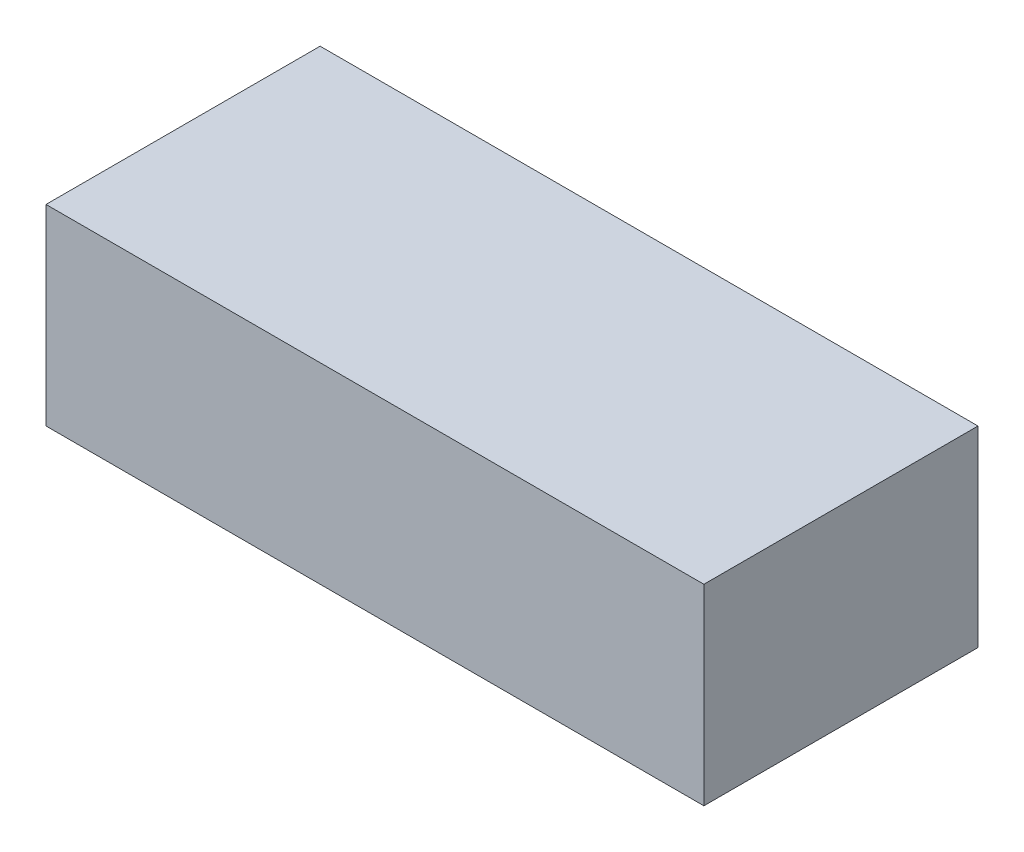
ISO-10303-21;
HEADER;
FILE_DESCRIPTION(('STEP AP214'),'2;1');
FILE_NAME('part.step','',(''),(''),'','','');
FILE_SCHEMA(('AUTOMOTIVE_DESIGN { 1 0 10303 214 1 1 1 1 }'));
ENDSEC;
DATA;
#1=APPLICATION_CONTEXT('core data for automotive mechanical design processes');
#2=APPLICATION_PROTOCOL_DEFINITION('international standard','automotive_design',2000,#1);
#3=PRODUCT_CONTEXT('',#1,'mechanical');
#4=PRODUCT('Part','Part','',(#3));
#5=PRODUCT_RELATED_PRODUCT_CATEGORY('part','',(#4));
#6=PRODUCT_DEFINITION_FORMATION('','',#4);
#7=PRODUCT_DEFINITION_CONTEXT('part definition',#1,'design');
#8=PRODUCT_DEFINITION('design','',#6,#7);
#9=PRODUCT_DEFINITION_SHAPE('','',#8);
#10=(LENGTH_UNIT() NAMED_UNIT(*) SI_UNIT(.MILLI.,.METRE.));
#11=(NAMED_UNIT(*) PLANE_ANGLE_UNIT() SI_UNIT($,.RADIAN.));
#12=(NAMED_UNIT(*) SI_UNIT($,.STERADIAN.) SOLID_ANGLE_UNIT());
#13=UNCERTAINTY_MEASURE_WITH_UNIT(LENGTH_MEASURE(1.E-05),#10,'distance_accuracy_value','');
#14=(GEOMETRIC_REPRESENTATION_CONTEXT(3) GLOBAL_UNCERTAINTY_ASSIGNED_CONTEXT((#13)) GLOBAL_UNIT_ASSIGNED_CONTEXT((#10,
#11,#12)) REPRESENTATION_CONTEXT('',''));
#15=CARTESIAN_POINT('',(0.,0.,0.));
#16=DIRECTION('',(0.,0.,1.));
#17=DIRECTION('',(1.,0.,0.));
#18=AXIS2_PLACEMENT_3D('',#15,#16,#17);
#19=CARTESIAN_POINT('',(0.,10.,0.));
#20=DIRECTION('',(0.,1.,0.));
#21=DIRECTION('',(0.,0.,1.));
#22=AXIS2_PLACEMENT_3D('',#19,#20,#21);
#23=PLANE('',#22);
#24=DIRECTION('',(0.,0.,1.));
#25=VECTOR('',#24,1.);
#26=CARTESIAN_POINT('',(-52.3769120422105,10.,-50.));
#27=LINE('',#26,#25);
#28=CARTESIAN_POINT('',(-52.3769120422105,10.,-50.));
#29=VERTEX_POINT('',#28);
#30=CARTESIAN_POINT('',(-52.3769120422105,10.,-10.));
#31=VERTEX_POINT('',#30);
#32=EDGE_CURVE('E214',#29,#31,#27,.T.);
#33=ORIENTED_EDGE('',*,*,#32,.F.);
#34=DIRECTION('',(1.,0.,0.));
#35=VECTOR('',#34,1.);
#36=CARTESIAN_POINT('',(65.0081833060556,10.,-50.));
#37=LINE('',#36,#35);
#38=CARTESIAN_POINT('',(-30.9918166939444,10.,-50.));
#39=VERTEX_POINT('',#38);
#40=EDGE_CURVE('E220',#29,#39,#37,.T.);
#41=ORIENTED_EDGE('',*,*,#40,.T.);
#42=DIRECTION('',(0.,0.,1.));
#43=VECTOR('',#42,1.);
#44=CARTESIAN_POINT('',(-30.9918166939444,10.,-10.));
#45=LINE('',#44,#43);
#46=CARTESIAN_POINT('',(-30.9918166939444,10.,-10.));
#47=VERTEX_POINT('',#46);
#48=EDGE_CURVE('E307',#39,#47,#45,.T.);
#49=ORIENTED_EDGE('',*,*,#48,.T.);
#50=DIRECTION('',(-1.,0.,0.));
#51=VECTOR('',#50,1.);
#52=CARTESIAN_POINT('',(-54.9918166939444,10.,-10.));
#53=LINE('',#52,#51);
#54=EDGE_CURVE('E310',#47,#31,#53,.T.);
#55=ORIENTED_EDGE('',*,*,#54,.T.);
#56=EDGE_LOOP('',(#33,#41,#49,#55));
#57=FACE_BOUND('',#56,.T.);
#58=ADVANCED_FACE('F42',(#57),#23,.F.);
#59=CARTESIAN_POINT('',(0.,-20.,-10.));
#60=DIRECTION('',(0.,0.,1.));
#61=DIRECTION('',(1.,0.,0.));
#62=AXIS2_PLACEMENT_3D('',#59,#60,#61);
#63=PLANE('',#62);
#64=DIRECTION('',(0.,-1.,0.));
#65=VECTOR('',#64,1.);
#66=CARTESIAN_POINT('',(-52.3769120422105,10.,-10.));
#67=LINE('',#66,#65);
#68=CARTESIAN_POINT('',(-52.3769120422105,-20.,-10.));
#69=VERTEX_POINT('',#68);
#70=EDGE_CURVE('E57',#31,#69,#67,.T.);
#71=ORIENTED_EDGE('',*,*,#70,.F.);
#72=ORIENTED_EDGE('',*,*,#54,.F.);
#73=DIRECTION('',(0.,1.,0.));
#74=VECTOR('',#73,1.);
#75=CARTESIAN_POINT('',(-30.9918166939444,-20.,-10.));
#76=LINE('',#75,#74);
#77=CARTESIAN_POINT('',(-30.9918166939444,-20.,-10.));
#78=VERTEX_POINT('',#77);
#79=EDGE_CURVE('E365',#78,#47,#76,.T.);
#80=ORIENTED_EDGE('',*,*,#79,.F.);
#81=DIRECTION('',(1.,0.,0.));
#82=VECTOR('',#81,1.);
#83=CARTESIAN_POINT('',(0.,-20.,-10.));
#84=LINE('',#83,#82);
#85=EDGE_CURVE('E316',#69,#78,#84,.T.);
#86=ORIENTED_EDGE('',*,*,#85,.F.);
#87=EDGE_LOOP('',(#71,#72,#80,#86));
#88=FACE_BOUND('',#87,.T.);
#89=ADVANCED_FACE('F440',(#88),#63,.F.);
#90=DIRECTION('',(0.,0.,1.));
#91=VECTOR('',#90,1.);
#92=CARTESIAN_POINT('',(62.568131576715,10.,-50.));
#93=LINE('',#92,#91);
#94=CARTESIAN_POINT('',(62.568131576715,10.,-50.));
#95=VERTEX_POINT('',#94);
#96=CARTESIAN_POINT('',(62.568131576715,10.,-10.));
#97=VERTEX_POINT('',#96);
#98=EDGE_CURVE('E233',#95,#97,#93,.T.);
#99=ORIENTED_EDGE('',*,*,#98,.T.);
#100=DIRECTION('',(-1.,0.,0.));
#101=VECTOR('',#100,1.);
#102=CARTESIAN_POINT('',(43.0081833060556,10.,-10.));
#103=LINE('',#102,#101);
#104=CARTESIAN_POINT('',(43.0081833060556,10.,-10.));
#105=VERTEX_POINT('',#104);
#106=EDGE_CURVE('E274',#97,#105,#103,.T.);
#107=ORIENTED_EDGE('',*,*,#106,.T.);
#108=DIRECTION('',(0.,0.,-1.));
#109=VECTOR('',#108,1.);
#110=CARTESIAN_POINT('',(43.0081833060556,10.,-25.));
#111=LINE('',#110,#109);
#112=CARTESIAN_POINT('',(43.0081833060556,10.,-50.));
#113=VERTEX_POINT('',#112);
#114=EDGE_CURVE('E277',#105,#113,#111,.T.);
#115=ORIENTED_EDGE('',*,*,#114,.T.);
#116=EDGE_CURVE('E272',#113,#95,#37,.T.);
#117=ORIENTED_EDGE('',*,*,#116,.T.);
#118=EDGE_LOOP('',(#99,#107,#115,#117));
#119=FACE_BOUND('',#118,.T.);
#120=ADVANCED_FACE('F401',(#119),#23,.F.);
#121=CARTESIAN_POINT('',(0.,-20.,-10.));
#122=DIRECTION('',(0.,0.,1.));
#123=DIRECTION('',(1.,0.,0.));
#124=AXIS2_PLACEMENT_3D('',#121,#122,#123);
#125=PLANE('',#124);
#126=DIRECTION('',(0.,1.,0.));
#127=VECTOR('',#126,1.);
#128=CARTESIAN_POINT('',(62.568131576715,-20.,-10.));
#129=LINE('',#128,#127);
#130=CARTESIAN_POINT('',(62.568131576715,-20.,-10.));
#131=VERTEX_POINT('',#130);
#132=EDGE_CURVE('E224',#131,#97,#129,.T.);
#133=ORIENTED_EDGE('',*,*,#132,.F.);
#134=DIRECTION('',(1.,0.,0.));
#135=VECTOR('',#134,1.);
#136=CARTESIAN_POINT('',(0.,-20.,-10.));
#137=LINE('',#136,#135);
#138=CARTESIAN_POINT('',(43.0081833060556,-20.,-10.));
#139=VERTEX_POINT('',#138);
#140=EDGE_CURVE('E344',#139,#131,#137,.T.);
#141=ORIENTED_EDGE('',*,*,#140,.F.);
#142=DIRECTION('',(0.,1.,0.));
#143=VECTOR('',#142,1.);
#144=CARTESIAN_POINT('',(43.0081833060556,-20.,-10.));
#145=LINE('',#144,#143);
#146=EDGE_CURVE('E350',#139,#105,#145,.T.);
#147=ORIENTED_EDGE('',*,*,#146,.T.);
#148=ORIENTED_EDGE('',*,*,#106,.F.);
#149=EDGE_LOOP('',(#133,#141,#147,#148));
#150=FACE_BOUND('',#149,.T.);
#151=ADVANCED_FACE('F488',(#150),#125,.F.);
#152=CARTESIAN_POINT('',(19.0081833060556,10.,-50.));
#153=VERTEX_POINT('',#152);
#154=CARTESIAN_POINT('',(41.0081833060556,10.,-50.));
#155=VERTEX_POINT('',#154);
#156=EDGE_CURVE('E403',#153,#155,#37,.T.);
#157=ORIENTED_EDGE('',*,*,#156,.T.);
#158=DIRECTION('',(0.,0.,1.));
#159=VECTOR('',#158,1.);
#160=CARTESIAN_POINT('',(41.0081833060556,10.,-10.));
#161=LINE('',#160,#159);
#162=CARTESIAN_POINT('',(41.0081833060556,10.,-10.));
#163=VERTEX_POINT('',#162);
#164=EDGE_CURVE('E280',#155,#163,#161,.T.);
#165=ORIENTED_EDGE('',*,*,#164,.T.);
#166=DIRECTION('',(-1.,0.,0.));
#167=VECTOR('',#166,1.);
#168=CARTESIAN_POINT('',(19.0081833060556,10.,-10.));
#169=LINE('',#168,#167);
#170=CARTESIAN_POINT('',(19.0081833060556,10.,-10.));
#171=VERTEX_POINT('',#170);
#172=EDGE_CURVE('E283',#163,#171,#169,.T.);
#173=ORIENTED_EDGE('',*,*,#172,.T.);
#174=DIRECTION('',(0.,0.,-1.));
#175=VECTOR('',#174,1.);
#176=CARTESIAN_POINT('',(19.0081833060556,10.,-25.));
#177=LINE('',#176,#175);
#178=EDGE_CURVE('E286',#171,#153,#177,.T.);
#179=ORIENTED_EDGE('',*,*,#178,.T.);
#180=EDGE_LOOP('',(#157,#165,#173,#179));
#181=FACE_BOUND('',#180,.T.);
#182=ADVANCED_FACE('F479',(#181),#23,.F.);
#183=CARTESIAN_POINT('',(-4.99349581397723,10.,-50.));
#184=VERTEX_POINT('',#183);
#185=CARTESIAN_POINT('',(17.0081833060556,10.,-50.));
#186=VERTEX_POINT('',#185);
#187=EDGE_CURVE('E405',#184,#186,#37,.T.);
#188=ORIENTED_EDGE('',*,*,#187,.T.);
#189=DIRECTION('',(0.,0.,1.));
#190=VECTOR('',#189,1.);
#191=CARTESIAN_POINT('',(17.0081833060556,10.,-10.));
#192=LINE('',#191,#190);
#193=CARTESIAN_POINT('',(17.0081833060556,10.,-10.));
#194=VERTEX_POINT('',#193);
#195=EDGE_CURVE('E289',#186,#194,#192,.T.);
#196=ORIENTED_EDGE('',*,*,#195,.T.);
#197=DIRECTION('',(-1.,0.,0.));
#198=VECTOR('',#197,1.);
#199=CARTESIAN_POINT('',(-4.99349581397723,10.,-10.));
#200=LINE('',#199,#198);
#201=CARTESIAN_POINT('',(-4.99349581397723,10.,-10.));
#202=VERTEX_POINT('',#201);
#203=EDGE_CURVE('E292',#194,#202,#200,.T.);
#204=ORIENTED_EDGE('',*,*,#203,.T.);
#205=DIRECTION('',(0.,0.,-1.));
#206=VECTOR('',#205,1.);
#207=CARTESIAN_POINT('',(-4.99349581397723,10.,-25.));
#208=LINE('',#207,#206);
#209=EDGE_CURVE('E295',#202,#184,#208,.T.);
#210=ORIENTED_EDGE('',*,*,#209,.T.);
#211=EDGE_LOOP('',(#188,#196,#204,#210));
#212=FACE_BOUND('',#211,.T.);
#213=ADVANCED_FACE('F487',(#212),#23,.F.);
#214=CARTESIAN_POINT('',(-28.9918166939444,10.,-50.));
#215=VERTEX_POINT('',#214);
#216=CARTESIAN_POINT('',(-6.99181669394436,10.,-50.));
#217=VERTEX_POINT('',#216);
#218=EDGE_CURVE('E275',#215,#217,#37,.T.);
#219=ORIENTED_EDGE('',*,*,#218,.T.);
#220=DIRECTION('',(0.,0.,1.));
#221=VECTOR('',#220,1.);
#222=CARTESIAN_POINT('',(-6.99181669394436,10.,-10.));
#223=LINE('',#222,#221);
#224=CARTESIAN_POINT('',(-6.99181669394436,10.,-10.));
#225=VERTEX_POINT('',#224);
#226=EDGE_CURVE('E298',#217,#225,#223,.T.);
#227=ORIENTED_EDGE('',*,*,#226,.T.);
#228=DIRECTION('',(-1.,0.,0.));
#229=VECTOR('',#228,1.);
#230=CARTESIAN_POINT('',(-28.9918166939444,10.,-10.));
#231=LINE('',#230,#229);
#232=CARTESIAN_POINT('',(-28.9918166939444,10.,-10.));
#233=VERTEX_POINT('',#232);
#234=EDGE_CURVE('E301',#225,#233,#231,.T.);
#235=ORIENTED_EDGE('',*,*,#234,.T.);
#236=DIRECTION('',(0.,0.,-1.));
#237=VECTOR('',#236,1.);
#238=CARTESIAN_POINT('',(-28.9918166939444,10.,-25.));
#239=LINE('',#238,#237);
#240=EDGE_CURVE('E304',#233,#215,#239,.T.);
#241=ORIENTED_EDGE('',*,*,#240,.T.);
#242=EDGE_LOOP('',(#219,#227,#235,#241));
#243=FACE_BOUND('',#242,.T.);
#244=ADVANCED_FACE('F414',(#243),#23,.F.);
#245=CARTESIAN_POINT('',(-54.9918166939444,15.,0.));
#246=DIRECTION('',(1.,0.,0.));
#247=DIRECTION('',(0.,0.,-1.));
#248=AXIS2_PLACEMENT_3D('',#245,#246,#247);
#249=PLANE('',#248);
#250=DIRECTION('',(0.,-1.,0.));
#251=VECTOR('',#250,1.);
#252=CARTESIAN_POINT('',(-54.9918166939444,15.,-50.));
#253=LINE('',#252,#251);
#254=CARTESIAN_POINT('',(-54.9918166939444,15.,-50.));
#255=VERTEX_POINT('',#254);
#256=CARTESIAN_POINT('',(-54.9918166939444,-20.,-50.));
#257=VERTEX_POINT('',#256);
#258=EDGE_CURVE('E374',#255,#257,#253,.T.);
#259=ORIENTED_EDGE('',*,*,#258,.T.);
#260=DIRECTION('',(0.,0.,-1.));
#261=VECTOR('',#260,1.);
#262=CARTESIAN_POINT('',(-54.9918166939444,-20.,0.));
#263=LINE('',#262,#261);
#264=CARTESIAN_POINT('',(-54.9918166939444,-20.,0.));
#265=VERTEX_POINT('',#264);
#266=EDGE_CURVE('E212',#265,#257,#263,.T.);
#267=ORIENTED_EDGE('',*,*,#266,.F.);
#268=DIRECTION('',(0.,-1.,0.));
#269=VECTOR('',#268,1.);
#270=CARTESIAN_POINT('',(-54.9918166939444,15.,0.));
#271=LINE('',#270,#269);
#272=CARTESIAN_POINT('',(-54.9918166939444,15.,0.));
#273=VERTEX_POINT('',#272);
#274=EDGE_CURVE('E11',#273,#265,#271,.T.);
#275=ORIENTED_EDGE('',*,*,#274,.F.);
#276=DIRECTION('',(0.,0.,1.));
#277=VECTOR('',#276,1.);
#278=CARTESIAN_POINT('',(-54.9918166939444,15.,0.));
#279=LINE('',#278,#277);
#280=EDGE_CURVE('E367',#255,#273,#279,.T.);
#281=ORIENTED_EDGE('',*,*,#280,.F.);
#282=EDGE_LOOP('',(#259,#267,#275,#281));
#283=FACE_BOUND('',#282,.T.);
#284=ADVANCED_FACE('F44',(#283),#249,.F.);
#285=CARTESIAN_POINT('',(-54.9918166939444,15.,0.));
#286=DIRECTION('',(0.,0.,-1.));
#287=DIRECTION('',(-1.,0.,0.));
#288=AXIS2_PLACEMENT_3D('',#285,#286,#287);
#289=PLANE('',#288);
#290=ORIENTED_EDGE('',*,*,#274,.T.);
#291=DIRECTION('',(-1.,0.,0.));
#292=VECTOR('',#291,1.);
#293=CARTESIAN_POINT('',(0.,-20.,0.));
#294=LINE('',#293,#292);
#295=CARTESIAN_POINT('',(65.0081833060557,-20.,0.));
#296=VERTEX_POINT('',#295);
#297=EDGE_CURVE('E313',#296,#265,#294,.T.);
#298=ORIENTED_EDGE('',*,*,#297,.F.);
#299=DIRECTION('',(0.,-1.,0.));
#300=VECTOR('',#299,1.);
#301=CARTESIAN_POINT('',(65.0081833060556,15.,0.));
#302=LINE('',#301,#300);
#303=CARTESIAN_POINT('',(65.0081833060556,15.,0.));
#304=VERTEX_POINT('',#303);
#305=EDGE_CURVE('E50',#304,#296,#302,.T.);
#306=ORIENTED_EDGE('',*,*,#305,.F.);
#307=DIRECTION('',(1.,0.,0.));
#308=VECTOR('',#307,1.);
#309=CARTESIAN_POINT('',(-54.9918166939444,15.,0.));
#310=LINE('',#309,#308);
#311=EDGE_CURVE('E369',#273,#304,#310,.T.);
#312=ORIENTED_EDGE('',*,*,#311,.F.);
#313=EDGE_LOOP('',(#290,#298,#306,#312));
#314=FACE_BOUND('',#313,.T.);
#315=ADVANCED_FACE('F387',(#314),#289,.F.);
#316=CARTESIAN_POINT('',(65.0081833060556,15.,0.));
#317=DIRECTION('',(-1.,0.,0.));
#318=DIRECTION('',(0.,0.,1.));
#319=AXIS2_PLACEMENT_3D('',#316,#317,#318);
#320=PLANE('',#319);
#321=DIRECTION('',(0.,0.,1.));
#322=VECTOR('',#321,1.);
#323=CARTESIAN_POINT('',(65.0081833060556,-20.,0.));
#324=LINE('',#323,#322);
#325=CARTESIAN_POINT('',(65.0081833060556,-20.,-50.));
#326=VERTEX_POINT('',#325);
#327=EDGE_CURVE('E347',#326,#296,#324,.T.);
#328=ORIENTED_EDGE('',*,*,#327,.F.);
#329=DIRECTION('',(0.,-1.,0.));
#330=VECTOR('',#329,1.);
#331=CARTESIAN_POINT('',(65.0081833060556,15.,-50.));
#332=LINE('',#331,#330);
#333=CARTESIAN_POINT('',(65.0081833060556,15.,-50.));
#334=VERTEX_POINT('',#333);
#335=EDGE_CURVE('E376',#334,#326,#332,.T.);
#336=ORIENTED_EDGE('',*,*,#335,.F.);
#337=DIRECTION('',(0.,0.,-1.));
#338=VECTOR('',#337,1.);
#339=CARTESIAN_POINT('',(65.0081833060556,15.,0.));
#340=LINE('',#339,#338);
#341=EDGE_CURVE('E371',#304,#334,#340,.T.);
#342=ORIENTED_EDGE('',*,*,#341,.F.);
#343=ORIENTED_EDGE('',*,*,#305,.T.);
#344=EDGE_LOOP('',(#328,#336,#342,#343));
#345=FACE_BOUND('',#344,.T.);
#346=ADVANCED_FACE('F381',(#345),#320,.F.);
#347=CARTESIAN_POINT('',(-54.9918166939444,15.,-50.));
#348=DIRECTION('',(0.,0.,1.));
#349=DIRECTION('',(1.,0.,0.));
#350=AXIS2_PLACEMENT_3D('',#347,#348,#349);
#351=PLANE('',#350);
#352=CARTESIAN_POINT('',(62.5081833060556,12.5,-50.));
#353=DIRECTION('',(0.,0.,-1.));
#354=DIRECTION('',(-1.,0.,0.));
#355=AXIS2_PLACEMENT_3D('',#352,#353,#354);
#356=CIRCLE('',#355,1.5);
#357=CARTESIAN_POINT('',(61.0081833060556,12.5,-50.));
#358=VERTEX_POINT('',#357);
#359=EDGE_CURVE('E443',#358,#358,#356,.T.);
#360=ORIENTED_EDGE('',*,*,#359,.F.);
#361=EDGE_LOOP('',(#360));
#362=FACE_BOUND('',#361,.T.);
#363=CARTESIAN_POINT('',(-52.4918166939444,12.5,-50.));
#364=DIRECTION('',(0.,0.,-1.));
#365=DIRECTION('',(-1.,0.,0.));
#366=AXIS2_PLACEMENT_3D('',#363,#364,#365);
#367=CIRCLE('',#366,1.5);
#368=CARTESIAN_POINT('',(-53.9918166939444,12.5,-50.));
#369=VERTEX_POINT('',#368);
#370=EDGE_CURVE('E449',#369,#369,#367,.T.);
#371=ORIENTED_EDGE('',*,*,#370,.F.);
#372=EDGE_LOOP('',(#371));
#373=FACE_BOUND('',#372,.T.);
#374=ORIENTED_EDGE('',*,*,#335,.T.);
#375=DIRECTION('',(-1.,0.,0.));
#376=VECTOR('',#375,1.);
#377=CARTESIAN_POINT('',(65.0081833060556,-20.,-50.));
#378=LINE('',#377,#376);
#379=CARTESIAN_POINT('',(62.568131576715,-20.,-50.));
#380=VERTEX_POINT('',#379);
#381=EDGE_CURVE('E226',#326,#380,#378,.T.);
#382=ORIENTED_EDGE('',*,*,#381,.T.);
#383=DIRECTION('',(0.,1.,0.));
#384=VECTOR('',#383,1.);
#385=CARTESIAN_POINT('',(62.568131576715,-20.,-50.));
#386=LINE('',#385,#384);
#387=EDGE_CURVE('E232',#380,#95,#386,.T.);
#388=ORIENTED_EDGE('',*,*,#387,.T.);
#389=ORIENTED_EDGE('',*,*,#116,.F.);
#390=DIRECTION('',(0.,1.,0.));
#391=VECTOR('',#390,1.);
#392=CARTESIAN_POINT('',(43.0081833060556,-20.,-50.));
#393=LINE('',#392,#391);
#394=CARTESIAN_POINT('',(43.0081833060556,-20.,-50.));
#395=VERTEX_POINT('',#394);
#396=EDGE_CURVE('E257',#395,#113,#393,.T.);
#397=ORIENTED_EDGE('',*,*,#396,.F.);
#398=DIRECTION('',(1.,0.,0.));
#399=VECTOR('',#398,1.);
#400=CARTESIAN_POINT('',(-30.9918166939444,-20.,-50.));
#401=LINE('',#400,#399);
#402=CARTESIAN_POINT('',(41.0081833060556,-20.,-50.));
#403=VERTEX_POINT('',#402);
#404=EDGE_CURVE('E243',#403,#395,#401,.T.);
#405=ORIENTED_EDGE('',*,*,#404,.F.);
#406=DIRECTION('',(0.,1.,0.));
#407=VECTOR('',#406,1.);
#408=CARTESIAN_POINT('',(41.0081833060556,-20.,-50.));
#409=LINE('',#408,#407);
#410=EDGE_CURVE('E259',#403,#155,#409,.T.);
#411=ORIENTED_EDGE('',*,*,#410,.T.);
#412=ORIENTED_EDGE('',*,*,#156,.F.);
#413=DIRECTION('',(0.,1.,0.));
#414=VECTOR('',#413,1.);
#415=CARTESIAN_POINT('',(19.0081833060556,-20.,-50.));
#416=LINE('',#415,#414);
#417=CARTESIAN_POINT('',(19.0081833060556,-20.,-50.));
#418=VERTEX_POINT('',#417);
#419=EDGE_CURVE('E262',#418,#153,#416,.T.);
#420=ORIENTED_EDGE('',*,*,#419,.F.);
#421=CARTESIAN_POINT('',(17.0081833060556,-20.,-50.));
#422=VERTEX_POINT('',#421);
#423=EDGE_CURVE('E988',#422,#418,#401,.T.);
#424=ORIENTED_EDGE('',*,*,#423,.F.);
#425=DIRECTION('',(0.,1.,0.));
#426=VECTOR('',#425,1.);
#427=CARTESIAN_POINT('',(17.0081833060556,-20.,-50.));
#428=LINE('',#427,#426);
#429=EDGE_CURVE('E264',#422,#186,#428,.T.);
#430=ORIENTED_EDGE('',*,*,#429,.T.);
#431=ORIENTED_EDGE('',*,*,#187,.F.);
#432=DIRECTION('',(0.,1.,0.));
#433=VECTOR('',#432,1.);
#434=CARTESIAN_POINT('',(-4.99349581397723,-20.,-50.));
#435=LINE('',#434,#433);
#436=CARTESIAN_POINT('',(-4.99349581397723,-20.,-50.));
#437=VERTEX_POINT('',#436);
#438=EDGE_CURVE('E266',#437,#184,#435,.T.);
#439=ORIENTED_EDGE('',*,*,#438,.F.);
#440=CARTESIAN_POINT('',(-6.99181669394436,-20.,-50.));
#441=VERTEX_POINT('',#440);
#442=EDGE_CURVE('E256',#441,#437,#401,.T.);
#443=ORIENTED_EDGE('',*,*,#442,.F.);
#444=DIRECTION('',(0.,1.,0.));
#445=VECTOR('',#444,1.);
#446=CARTESIAN_POINT('',(-6.99181669394436,-20.,-50.));
#447=LINE('',#446,#445);
#448=EDGE_CURVE('E268',#441,#217,#447,.T.);
#449=ORIENTED_EDGE('',*,*,#448,.T.);
#450=ORIENTED_EDGE('',*,*,#218,.F.);
#451=DIRECTION('',(0.,1.,0.));
#452=VECTOR('',#451,1.);
#453=CARTESIAN_POINT('',(-28.9918166939444,-20.,-50.));
#454=LINE('',#453,#452);
#455=CARTESIAN_POINT('',(-28.9918166939444,-20.,-50.));
#456=VERTEX_POINT('',#455);
#457=EDGE_CURVE('E270',#456,#215,#454,.T.);
#458=ORIENTED_EDGE('',*,*,#457,.F.);
#459=CARTESIAN_POINT('',(-30.9918166939444,-20.,-50.));
#460=VERTEX_POINT('',#459);
#461=EDGE_CURVE('E252',#460,#456,#401,.T.);
#462=ORIENTED_EDGE('',*,*,#461,.F.);
#463=DIRECTION('',(0.,1.,0.));
#464=VECTOR('',#463,1.);
#465=CARTESIAN_POINT('',(-30.9918166939444,-20.,-50.));
#466=LINE('',#465,#464);
#467=EDGE_CURVE('E255',#460,#39,#466,.T.);
#468=ORIENTED_EDGE('',*,*,#467,.T.);
#469=ORIENTED_EDGE('',*,*,#40,.F.);
#470=DIRECTION('',(0.,-1.,0.));
#471=VECTOR('',#470,1.);
#472=CARTESIAN_POINT('',(-52.3769120422105,10.,-50.));
#473=LINE('',#472,#471);
#474=CARTESIAN_POINT('',(-52.3769120422105,-20.,-50.));
#475=VERTEX_POINT('',#474);
#476=EDGE_CURVE('E215',#29,#475,#473,.T.);
#477=ORIENTED_EDGE('',*,*,#476,.T.);
#478=DIRECTION('',(-1.,0.,0.));
#479=VECTOR('',#478,1.);
#480=CARTESIAN_POINT('',(-52.3769120422105,-20.,-50.));
#481=LINE('',#480,#479);
#482=EDGE_CURVE('E204',#475,#257,#481,.T.);
#483=ORIENTED_EDGE('',*,*,#482,.T.);
#484=ORIENTED_EDGE('',*,*,#258,.F.);
#485=DIRECTION('',(-1.,0.,0.));
#486=VECTOR('',#485,1.);
#487=CARTESIAN_POINT('',(-54.9918166939444,15.,-50.));
#488=LINE('',#487,#486);
#489=EDGE_CURVE('E65',#334,#255,#488,.T.);
#490=ORIENTED_EDGE('',*,*,#489,.F.);
#491=EDGE_LOOP('',(#374,#382,#388,#389,#397,#405,#411,#412,#420,#424,#430,#431,#439,#443,#449,
#450,#458,#462,#468,#469,#477,#483,#484,#490));
#492=FACE_BOUND('',#491,.T.);
#493=ADVANCED_FACE('F218',(#362,#373,#492),#351,.F.);
#494=CARTESIAN_POINT('',(0.,15.,0.));
#495=DIRECTION('',(0.,-1.,0.));
#496=DIRECTION('',(0.,0.,-1.));
#497=AXIS2_PLACEMENT_3D('',#494,#495,#496);
#498=PLANE('',#497);
#499=ORIENTED_EDGE('',*,*,#280,.T.);
#500=ORIENTED_EDGE('',*,*,#311,.T.);
#501=ORIENTED_EDGE('',*,*,#341,.T.);
#502=ORIENTED_EDGE('',*,*,#489,.T.);
#503=EDGE_LOOP('',(#499,#500,#501,#502));
#504=FACE_BOUND('',#503,.T.);
#505=ADVANCED_FACE('F459',(#504),#498,.F.);
#506=CARTESIAN_POINT('',(-30.9918166939444,-20.,0.));
#507=DIRECTION('',(-1.,0.,0.));
#508=DIRECTION('',(0.,0.,1.));
#509=AXIS2_PLACEMENT_3D('',#506,#507,#508);
#510=PLANE('',#509);
#511=ORIENTED_EDGE('',*,*,#467,.F.);
#512=DIRECTION('',(0.,0.,1.));
#513=VECTOR('',#512,1.);
#514=CARTESIAN_POINT('',(-30.9918166939444,-20.,0.));
#515=LINE('',#514,#513);
#516=EDGE_CURVE('E318',#460,#78,#515,.T.);
#517=ORIENTED_EDGE('',*,*,#516,.T.);
#518=ORIENTED_EDGE('',*,*,#79,.T.);
#519=ORIENTED_EDGE('',*,*,#48,.F.);
#520=EDGE_LOOP('',(#511,#517,#518,#519));
#521=FACE_BOUND('',#520,.T.);
#522=ADVANCED_FACE('F435',(#521),#510,.T.);
#523=CARTESIAN_POINT('',(-28.9918166939444,-20.,0.));
#524=DIRECTION('',(-1.,0.,0.));
#525=DIRECTION('',(0.,0.,1.));
#526=AXIS2_PLACEMENT_3D('',#523,#524,#525);
#527=PLANE('',#526);
#528=DIRECTION('',(0.,0.,1.));
#529=VECTOR('',#528,1.);
#530=CARTESIAN_POINT('',(-28.9918166939444,-20.,0.));
#531=LINE('',#530,#529);
#532=CARTESIAN_POINT('',(-28.9918166939444,-20.,-10.));
#533=VERTEX_POINT('',#532);
#534=EDGE_CURVE('E321',#456,#533,#531,.T.);
#535=ORIENTED_EDGE('',*,*,#534,.F.);
#536=ORIENTED_EDGE('',*,*,#457,.T.);
#537=ORIENTED_EDGE('',*,*,#240,.F.);
#538=DIRECTION('',(0.,1.,0.));
#539=VECTOR('',#538,1.);
#540=CARTESIAN_POINT('',(-28.9918166939444,-20.,-10.));
#541=LINE('',#540,#539);
#542=EDGE_CURVE('E363',#533,#233,#541,.T.);
#543=ORIENTED_EDGE('',*,*,#542,.F.);
#544=EDGE_LOOP('',(#535,#536,#537,#543));
#545=FACE_BOUND('',#544,.T.);
#546=ADVANCED_FACE('F430',(#545),#527,.F.);
#547=CARTESIAN_POINT('',(0.,-20.,-10.));
#548=DIRECTION('',(0.,0.,1.));
#549=DIRECTION('',(1.,0.,0.));
#550=AXIS2_PLACEMENT_3D('',#547,#548,#549);
#551=PLANE('',#550);
#552=ORIENTED_EDGE('',*,*,#542,.T.);
#553=ORIENTED_EDGE('',*,*,#234,.F.);
#554=DIRECTION('',(0.,1.,0.));
#555=VECTOR('',#554,1.);
#556=CARTESIAN_POINT('',(-6.99181669394436,-20.,-10.));
#557=LINE('',#556,#555);
#558=CARTESIAN_POINT('',(-6.99181669394436,-20.,-10.));
#559=VERTEX_POINT('',#558);
#560=EDGE_CURVE('E361',#559,#225,#557,.T.);
#561=ORIENTED_EDGE('',*,*,#560,.F.);
#562=DIRECTION('',(1.,0.,0.));
#563=VECTOR('',#562,1.);
#564=CARTESIAN_POINT('',(0.,-20.,-10.));
#565=LINE('',#564,#563);
#566=EDGE_CURVE('E323',#533,#559,#565,.T.);
#567=ORIENTED_EDGE('',*,*,#566,.F.);
#568=EDGE_LOOP('',(#552,#553,#561,#567));
#569=FACE_BOUND('',#568,.T.);
#570=ADVANCED_FACE('F426',(#569),#551,.F.);
#571=CARTESIAN_POINT('',(-6.99181669394436,-20.,0.));
#572=DIRECTION('',(-1.,0.,0.));
#573=DIRECTION('',(0.,0.,1.));
#574=AXIS2_PLACEMENT_3D('',#571,#572,#573);
#575=PLANE('',#574);
#576=ORIENTED_EDGE('',*,*,#448,.F.);
#577=DIRECTION('',(0.,0.,1.));
#578=VECTOR('',#577,1.);
#579=CARTESIAN_POINT('',(-6.99181669394436,-20.,0.));
#580=LINE('',#579,#578);
#581=EDGE_CURVE('E326',#441,#559,#580,.T.);
#582=ORIENTED_EDGE('',*,*,#581,.T.);
#583=ORIENTED_EDGE('',*,*,#560,.T.);
#584=ORIENTED_EDGE('',*,*,#226,.F.);
#585=EDGE_LOOP('',(#576,#582,#583,#584));
#586=FACE_BOUND('',#585,.T.);
#587=ADVANCED_FACE('F421',(#586),#575,.T.);
#588=CARTESIAN_POINT('',(-4.99349581397723,-20.,0.));
#589=DIRECTION('',(-1.,0.,0.));
#590=DIRECTION('',(0.,0.,1.));
#591=AXIS2_PLACEMENT_3D('',#588,#589,#590);
#592=PLANE('',#591);
#593=DIRECTION('',(0.,0.,1.));
#594=VECTOR('',#593,1.);
#595=CARTESIAN_POINT('',(-4.99349581397723,-20.,0.));
#596=LINE('',#595,#594);
#597=CARTESIAN_POINT('',(-4.99349581397723,-20.,-10.));
#598=VERTEX_POINT('',#597);
#599=EDGE_CURVE('E328',#437,#598,#596,.T.);
#600=ORIENTED_EDGE('',*,*,#599,.F.);
#601=ORIENTED_EDGE('',*,*,#438,.T.);
#602=ORIENTED_EDGE('',*,*,#209,.F.);
#603=DIRECTION('',(0.,1.,0.));
#604=VECTOR('',#603,1.);
#605=CARTESIAN_POINT('',(-4.99349581397723,-20.,-10.));
#606=LINE('',#605,#604);
#607=EDGE_CURVE('E359',#598,#202,#606,.T.);
#608=ORIENTED_EDGE('',*,*,#607,.F.);
#609=EDGE_LOOP('',(#600,#601,#602,#608));
#610=FACE_BOUND('',#609,.T.);
#611=ADVANCED_FACE('F656',(#610),#592,.F.);
#612=CARTESIAN_POINT('',(0.,-20.,-10.));
#613=DIRECTION('',(0.,0.,1.));
#614=DIRECTION('',(1.,0.,0.));
#615=AXIS2_PLACEMENT_3D('',#612,#613,#614);
#616=PLANE('',#615);
#617=ORIENTED_EDGE('',*,*,#607,.T.);
#618=ORIENTED_EDGE('',*,*,#203,.F.);
#619=DIRECTION('',(0.,1.,0.));
#620=VECTOR('',#619,1.);
#621=CARTESIAN_POINT('',(17.0081833060556,-20.,-10.));
#622=LINE('',#621,#620);
#623=CARTESIAN_POINT('',(17.0081833060556,-20.,-10.));
#624=VERTEX_POINT('',#623);
#625=EDGE_CURVE('E357',#624,#194,#622,.T.);
#626=ORIENTED_EDGE('',*,*,#625,.F.);
#627=DIRECTION('',(1.,0.,0.));
#628=VECTOR('',#627,1.);
#629=CARTESIAN_POINT('',(0.,-20.,-10.));
#630=LINE('',#629,#628);
#631=EDGE_CURVE('E330',#598,#624,#630,.T.);
#632=ORIENTED_EDGE('',*,*,#631,.F.);
#633=EDGE_LOOP('',(#617,#618,#626,#632));
#634=FACE_BOUND('',#633,.T.);
#635=ADVANCED_FACE('F663',(#634),#616,.F.);
#636=CARTESIAN_POINT('',(17.0081833060556,-20.,0.));
#637=DIRECTION('',(-1.,0.,0.));
#638=DIRECTION('',(0.,0.,1.));
#639=AXIS2_PLACEMENT_3D('',#636,#637,#638);
#640=PLANE('',#639);
#641=ORIENTED_EDGE('',*,*,#429,.F.);
#642=DIRECTION('',(0.,0.,1.));
#643=VECTOR('',#642,1.);
#644=CARTESIAN_POINT('',(17.0081833060556,-20.,0.));
#645=LINE('',#644,#643);
#646=EDGE_CURVE('E333',#422,#624,#645,.T.);
#647=ORIENTED_EDGE('',*,*,#646,.T.);
#648=ORIENTED_EDGE('',*,*,#625,.T.);
#649=ORIENTED_EDGE('',*,*,#195,.F.);
#650=EDGE_LOOP('',(#641,#647,#648,#649));
#651=FACE_BOUND('',#650,.T.);
#652=ADVANCED_FACE('F671',(#651),#640,.T.);
#653=CARTESIAN_POINT('',(19.0081833060556,-20.,0.));
#654=DIRECTION('',(-1.,0.,0.));
#655=DIRECTION('',(0.,0.,1.));
#656=AXIS2_PLACEMENT_3D('',#653,#654,#655);
#657=PLANE('',#656);
#658=DIRECTION('',(0.,0.,1.));
#659=VECTOR('',#658,1.);
#660=CARTESIAN_POINT('',(19.0081833060556,-20.,0.));
#661=LINE('',#660,#659);
#662=CARTESIAN_POINT('',(19.0081833060556,-20.,-10.));
#663=VERTEX_POINT('',#662);
#664=EDGE_CURVE('E335',#418,#663,#661,.T.);
#665=ORIENTED_EDGE('',*,*,#664,.F.);
#666=ORIENTED_EDGE('',*,*,#419,.T.);
#667=ORIENTED_EDGE('',*,*,#178,.F.);
#668=DIRECTION('',(0.,1.,0.));
#669=VECTOR('',#668,1.);
#670=CARTESIAN_POINT('',(19.0081833060556,-20.,-10.));
#671=LINE('',#670,#669);
#672=EDGE_CURVE('E355',#663,#171,#671,.T.);
#673=ORIENTED_EDGE('',*,*,#672,.F.);
#674=EDGE_LOOP('',(#665,#666,#667,#673));
#675=FACE_BOUND('',#674,.T.);
#676=ADVANCED_FACE('F678',(#675),#657,.F.);
#677=CARTESIAN_POINT('',(0.,-20.,-10.));
#678=DIRECTION('',(0.,0.,1.));
#679=DIRECTION('',(1.,0.,0.));
#680=AXIS2_PLACEMENT_3D('',#677,#678,#679);
#681=PLANE('',#680);
#682=ORIENTED_EDGE('',*,*,#672,.T.);
#683=ORIENTED_EDGE('',*,*,#172,.F.);
#684=DIRECTION('',(0.,1.,0.));
#685=VECTOR('',#684,1.);
#686=CARTESIAN_POINT('',(41.0081833060556,-20.,-10.));
#687=LINE('',#686,#685);
#688=CARTESIAN_POINT('',(41.0081833060556,-20.,-10.));
#689=VERTEX_POINT('',#688);
#690=EDGE_CURVE('E353',#689,#163,#687,.T.);
#691=ORIENTED_EDGE('',*,*,#690,.F.);
#692=DIRECTION('',(1.,0.,0.));
#693=VECTOR('',#692,1.);
#694=CARTESIAN_POINT('',(0.,-20.,-10.));
#695=LINE('',#694,#693);
#696=EDGE_CURVE('E337',#663,#689,#695,.T.);
#697=ORIENTED_EDGE('',*,*,#696,.F.);
#698=EDGE_LOOP('',(#682,#683,#691,#697));
#699=FACE_BOUND('',#698,.T.);
#700=ADVANCED_FACE('F686',(#699),#681,.F.);
#701=CARTESIAN_POINT('',(41.0081833060556,-20.,0.));
#702=DIRECTION('',(-1.,0.,0.));
#703=DIRECTION('',(0.,0.,1.));
#704=AXIS2_PLACEMENT_3D('',#701,#702,#703);
#705=PLANE('',#704);
#706=ORIENTED_EDGE('',*,*,#410,.F.);
#707=DIRECTION('',(0.,0.,1.));
#708=VECTOR('',#707,1.);
#709=CARTESIAN_POINT('',(41.0081833060556,-20.,0.));
#710=LINE('',#709,#708);
#711=EDGE_CURVE('E340',#403,#689,#710,.T.);
#712=ORIENTED_EDGE('',*,*,#711,.T.);
#713=ORIENTED_EDGE('',*,*,#690,.T.);
#714=ORIENTED_EDGE('',*,*,#164,.F.);
#715=EDGE_LOOP('',(#706,#712,#713,#714));
#716=FACE_BOUND('',#715,.T.);
#717=ADVANCED_FACE('F694',(#716),#705,.T.);
#718=CARTESIAN_POINT('',(43.0081833060556,-20.,0.));
#719=DIRECTION('',(-1.,0.,0.));
#720=DIRECTION('',(0.,0.,1.));
#721=AXIS2_PLACEMENT_3D('',#718,#719,#720);
#722=PLANE('',#721);
#723=DIRECTION('',(0.,0.,1.));
#724=VECTOR('',#723,1.);
#725=CARTESIAN_POINT('',(43.0081833060556,-20.,0.));
#726=LINE('',#725,#724);
#727=EDGE_CURVE('E342',#395,#139,#726,.T.);
#728=ORIENTED_EDGE('',*,*,#727,.F.);
#729=ORIENTED_EDGE('',*,*,#396,.T.);
#730=ORIENTED_EDGE('',*,*,#114,.F.);
#731=ORIENTED_EDGE('',*,*,#146,.F.);
#732=EDGE_LOOP('',(#728,#729,#730,#731));
#733=FACE_BOUND('',#732,.T.);
#734=ADVANCED_FACE('F569',(#733),#722,.F.);
#735=CARTESIAN_POINT('',(0.,-20.,0.));
#736=DIRECTION('',(0.,-1.,0.));
#737=DIRECTION('',(0.,0.,-1.));
#738=AXIS2_PLACEMENT_3D('',#735,#736,#737);
#739=PLANE('',#738);
#740=CARTESIAN_POINT('',(-49.9918166939444,-20.,-5.));
#741=DIRECTION('',(0.,-1.,0.));
#742=DIRECTION('',(0.,0.,-1.));
#743=AXIS2_PLACEMENT_3D('',#740,#741,#742);
#744=CIRCLE('',#743,3.);
#745=CARTESIAN_POINT('',(-49.9918166939444,-20.,-8.));
#746=VERTEX_POINT('',#745);
#747=EDGE_CURVE('E244',#746,#746,#744,.T.);
#748=ORIENTED_EDGE('',*,*,#747,.F.);
#749=EDGE_LOOP('',(#748));
#750=FACE_BOUND('',#749,.T.);
#751=CARTESIAN_POINT('',(60.0081833060556,-20.,-5.));
#752=DIRECTION('',(0.,-1.,0.));
#753=DIRECTION('',(0.,0.,-1.));
#754=AXIS2_PLACEMENT_3D('',#751,#752,#753);
#755=CIRCLE('',#754,3.00000000000002);
#756=CARTESIAN_POINT('',(60.0081833060556,-20.,-8.00000000000002));
#757=VERTEX_POINT('',#756);
#758=EDGE_CURVE('E247',#757,#757,#755,.T.);
#759=ORIENTED_EDGE('',*,*,#758,.F.);
#760=EDGE_LOOP('',(#759));
#761=FACE_BOUND('',#760,.T.);
#762=ORIENTED_EDGE('',*,*,#404,.T.);
#763=ORIENTED_EDGE('',*,*,#727,.T.);
#764=ORIENTED_EDGE('',*,*,#140,.T.);
#765=DIRECTION('',(0.,0.,1.));
#766=VECTOR('',#765,1.);
#767=CARTESIAN_POINT('',(62.568131576715,-20.,-50.));
#768=LINE('',#767,#766);
#769=EDGE_CURVE('E237',#380,#131,#768,.T.);
#770=ORIENTED_EDGE('',*,*,#769,.F.);
#771=ORIENTED_EDGE('',*,*,#381,.F.);
#772=ORIENTED_EDGE('',*,*,#327,.T.);
#773=ORIENTED_EDGE('',*,*,#297,.T.);
#774=ORIENTED_EDGE('',*,*,#266,.T.);
#775=ORIENTED_EDGE('',*,*,#482,.F.);
#776=DIRECTION('',(0.,0.,1.));
#777=VECTOR('',#776,1.);
#778=CARTESIAN_POINT('',(-52.3769120422105,-20.,-50.));
#779=LINE('',#778,#777);
#780=EDGE_CURVE('E208',#475,#69,#779,.T.);
#781=ORIENTED_EDGE('',*,*,#780,.T.);
#782=ORIENTED_EDGE('',*,*,#85,.T.);
#783=ORIENTED_EDGE('',*,*,#516,.F.);
#784=ORIENTED_EDGE('',*,*,#461,.T.);
#785=ORIENTED_EDGE('',*,*,#534,.T.);
#786=ORIENTED_EDGE('',*,*,#566,.T.);
#787=ORIENTED_EDGE('',*,*,#581,.F.);
#788=ORIENTED_EDGE('',*,*,#442,.T.);
#789=ORIENTED_EDGE('',*,*,#599,.T.);
#790=ORIENTED_EDGE('',*,*,#631,.T.);
#791=ORIENTED_EDGE('',*,*,#646,.F.);
#792=ORIENTED_EDGE('',*,*,#423,.T.);
#793=ORIENTED_EDGE('',*,*,#664,.T.);
#794=ORIENTED_EDGE('',*,*,#696,.T.);
#795=ORIENTED_EDGE('',*,*,#711,.F.);
#796=EDGE_LOOP('',(#762,#763,#764,#770,#771,#772,#773,#774,#775,#781,#782,#783,#784,#785,#786,
#787,#788,#789,#790,#791,#792,#793,#794,#795));
#797=FACE_BOUND('',#796,.T.);
#798=ADVANCED_FACE('F207',(#750,#761,#797),#739,.T.);
#799=CARTESIAN_POINT('',(60.0081833060556,-15.,-5.));
#800=DIRECTION('',(0.,-1.,0.));
#801=DIRECTION('',(0.,0.,-1.));
#802=AXIS2_PLACEMENT_3D('',#799,#800,#801);
#803=CYLINDRICAL_SURFACE('',#802,3.00000000000002);
#804=CARTESIAN_POINT('',(60.0081833060556,-15.,-5.));
#805=DIRECTION('',(0.,-1.,0.));
#806=DIRECTION('',(0.,0.,-1.));
#807=AXIS2_PLACEMENT_3D('',#804,#805,#806);
#808=CIRCLE('',#807,3.00000000000002);
#809=CARTESIAN_POINT('',(60.0081833060556,-15.,-8.00000000000002));
#810=VERTEX_POINT('',#809);
#811=EDGE_CURVE('E239',#810,#810,#808,.T.);
#812=ORIENTED_EDGE('',*,*,#811,.F.);
#813=EDGE_LOOP('',(#812));
#814=FACE_BOUND('',#813,.T.);
#815=ORIENTED_EDGE('',*,*,#758,.T.);
#816=EDGE_LOOP('',(#815));
#817=FACE_BOUND('',#816,.T.);
#818=ADVANCED_FACE('F568',(#814,#817),#803,.F.);
#819=CARTESIAN_POINT('',(60.0081833060556,-15.,-5.));
#820=DIRECTION('',(0.,-1.,0.));
#821=DIRECTION('',(0.,0.,-1.));
#822=AXIS2_PLACEMENT_3D('',#819,#820,#821);
#823=PLANE('',#822);
#824=ORIENTED_EDGE('',*,*,#811,.T.);
#825=EDGE_LOOP('',(#824));
#826=FACE_BOUND('',#825,.T.);
#827=ADVANCED_FACE('F718',(#826),#823,.T.);
#828=CARTESIAN_POINT('',(-49.9918166939444,-15.,-5.));
#829=DIRECTION('',(0.,-1.,0.));
#830=DIRECTION('',(0.,0.,-1.));
#831=AXIS2_PLACEMENT_3D('',#828,#829,#830);
#832=CYLINDRICAL_SURFACE('',#831,3.);
#833=CARTESIAN_POINT('',(-49.9918166939444,-15.,-5.));
#834=DIRECTION('',(0.,-1.,0.));
#835=DIRECTION('',(0.,0.,-1.));
#836=AXIS2_PLACEMENT_3D('',#833,#834,#835);
#837=CIRCLE('',#836,3.);
#838=CARTESIAN_POINT('',(-49.9918166939444,-15.,-8.));
#839=VERTEX_POINT('',#838);
#840=EDGE_CURVE('E240',#839,#839,#837,.T.);
#841=ORIENTED_EDGE('',*,*,#840,.F.);
#842=EDGE_LOOP('',(#841));
#843=FACE_BOUND('',#842,.T.);
#844=ORIENTED_EDGE('',*,*,#747,.T.);
#845=EDGE_LOOP('',(#844));
#846=FACE_BOUND('',#845,.T.);
#847=ADVANCED_FACE('F730',(#843,#846),#832,.F.);
#848=CARTESIAN_POINT('',(-49.9918166939444,-15.,-5.));
#849=DIRECTION('',(0.,-1.,0.));
#850=DIRECTION('',(0.,0.,-1.));
#851=AXIS2_PLACEMENT_3D('',#848,#849,#850);
#852=PLANE('',#851);
#853=ORIENTED_EDGE('',*,*,#840,.T.);
#854=EDGE_LOOP('',(#853));
#855=FACE_BOUND('',#854,.T.);
#856=ADVANCED_FACE('F535',(#855),#852,.T.);
#857=CARTESIAN_POINT('',(62.568131576715,-20.,-50.));
#858=DIRECTION('',(1.,0.,0.));
#859=DIRECTION('',(0.,0.,-1.));
#860=AXIS2_PLACEMENT_3D('',#857,#858,#859);
#861=PLANE('',#860);
#862=ORIENTED_EDGE('',*,*,#132,.T.);
#863=ORIENTED_EDGE('',*,*,#98,.F.);
#864=ORIENTED_EDGE('',*,*,#387,.F.);
#865=ORIENTED_EDGE('',*,*,#769,.T.);
#866=EDGE_LOOP('',(#862,#863,#864,#865));
#867=FACE_BOUND('',#866,.T.);
#868=ADVANCED_FACE('F397',(#867),#861,.F.);
#869=CARTESIAN_POINT('',(-52.3769120422105,10.,-50.));
#870=DIRECTION('',(-1.,0.,0.));
#871=DIRECTION('',(0.,0.,1.));
#872=AXIS2_PLACEMENT_3D('',#869,#870,#871);
#873=PLANE('',#872);
#874=ORIENTED_EDGE('',*,*,#70,.T.);
#875=ORIENTED_EDGE('',*,*,#780,.F.);
#876=ORIENTED_EDGE('',*,*,#476,.F.);
#877=ORIENTED_EDGE('',*,*,#32,.T.);
#878=EDGE_LOOP('',(#874,#875,#876,#877));
#879=FACE_BOUND('',#878,.T.);
#880=ADVANCED_FACE('F223',(#879),#873,.F.);
#881=CARTESIAN_POINT('',(-52.4918166939444,12.5,-45.));
#882=DIRECTION('',(0.,0.,-1.));
#883=DIRECTION('',(-1.,0.,0.));
#884=AXIS2_PLACEMENT_3D('',#881,#882,#883);
#885=CYLINDRICAL_SURFACE('',#884,1.5);
#886=CARTESIAN_POINT('',(-52.4918166939444,12.5,-45.));
#887=DIRECTION('',(0.,0.,-1.));
#888=DIRECTION('',(-1.,0.,0.));
#889=AXIS2_PLACEMENT_3D('',#886,#887,#888);
#890=CIRCLE('',#889,1.5);
#891=CARTESIAN_POINT('',(-53.9918166939444,12.5,-45.));
#892=VERTEX_POINT('',#891);
#893=EDGE_CURVE('E446',#892,#892,#890,.T.);
#894=ORIENTED_EDGE('',*,*,#893,.F.);
#895=EDGE_LOOP('',(#894));
#896=FACE_BOUND('',#895,.T.);
#897=ORIENTED_EDGE('',*,*,#370,.T.);
#898=EDGE_LOOP('',(#897));
#899=FACE_BOUND('',#898,.T.);
#900=ADVANCED_FACE('F463',(#896,#899),#885,.F.);
#901=CARTESIAN_POINT('',(-52.4918166939444,12.5,-45.));
#902=DIRECTION('',(0.,0.,-1.));
#903=DIRECTION('',(-1.,0.,0.));
#904=AXIS2_PLACEMENT_3D('',#901,#902,#903);
#905=PLANE('',#904);
#906=ORIENTED_EDGE('',*,*,#893,.T.);
#907=EDGE_LOOP('',(#906));
#908=FACE_BOUND('',#907,.T.);
#909=ADVANCED_FACE('F465',(#908),#905,.T.);
#910=CARTESIAN_POINT('',(62.5081833060556,12.5,-45.));
#911=DIRECTION('',(0.,0.,-1.));
#912=DIRECTION('',(-1.,0.,0.));
#913=AXIS2_PLACEMENT_3D('',#910,#911,#912);
#914=CYLINDRICAL_SURFACE('',#913,1.5);
#915=CARTESIAN_POINT('',(62.5081833060556,12.5,-45.));
#916=DIRECTION('',(0.,0.,-1.));
#917=DIRECTION('',(-1.,0.,0.));
#918=AXIS2_PLACEMENT_3D('',#915,#916,#917);
#919=CIRCLE('',#918,1.5);
#920=CARTESIAN_POINT('',(61.0081833060556,12.5,-45.));
#921=VERTEX_POINT('',#920);
#922=EDGE_CURVE('E441',#921,#921,#919,.T.);
#923=ORIENTED_EDGE('',*,*,#922,.F.);
#924=EDGE_LOOP('',(#923));
#925=FACE_BOUND('',#924,.T.);
#926=ORIENTED_EDGE('',*,*,#359,.T.);
#927=EDGE_LOOP('',(#926));
#928=FACE_BOUND('',#927,.T.);
#929=ADVANCED_FACE('F455',(#925,#928),#914,.F.);
#930=CARTESIAN_POINT('',(62.5081833060556,12.5,-45.));
#931=DIRECTION('',(0.,0.,-1.));
#932=DIRECTION('',(-1.,0.,0.));
#933=AXIS2_PLACEMENT_3D('',#930,#931,#932);
#934=PLANE('',#933);
#935=ORIENTED_EDGE('',*,*,#922,.T.);
#936=EDGE_LOOP('',(#935));
#937=FACE_BOUND('',#936,.T.);
#938=ADVANCED_FACE('F605',(#937),#934,.T.);
#939=CLOSED_SHELL('',(#58,#89,#120,#151,#182,#213,#244,#284,#315,#346,#493,#505,#522,#546,#570,
#587,#611,#635,#652,#676,#700,#717,#734,#798,#818,#827,#847,#856,#868,#880,#900,#909,#929,#938));
#940=MANIFOLD_SOLID_BREP('B2',#939);
#941=ADVANCED_BREP_SHAPE_REPRESENTATION('',(#18,#940),#14);
#942=SHAPE_DEFINITION_REPRESENTATION(#9,#941);
ENDSEC;
END-ISO-10303-21;
